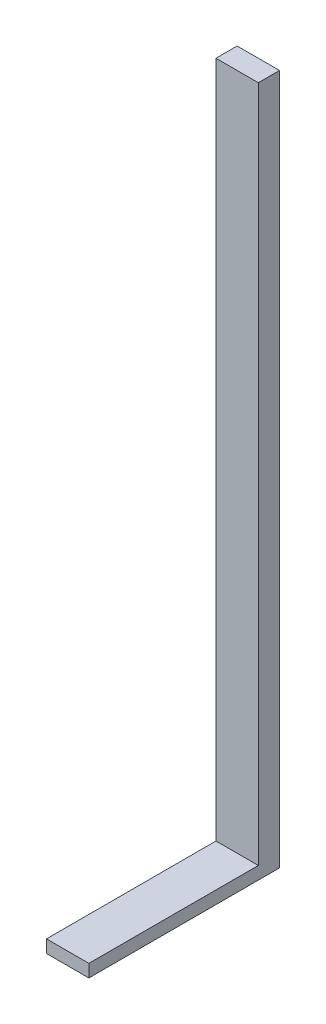
ISO-10303-21;
HEADER;
FILE_DESCRIPTION(('STEP AP214'),'2;1');
FILE_NAME('part.step','',(''),(''),'','','');
FILE_SCHEMA(('AUTOMOTIVE_DESIGN { 1 0 10303 214 1 1 1 1 }'));
ENDSEC;
DATA;
#1=APPLICATION_CONTEXT('core data for automotive mechanical design processes');
#2=APPLICATION_PROTOCOL_DEFINITION('international standard','automotive_design',2000,#1);
#3=PRODUCT_CONTEXT('',#1,'mechanical');
#4=PRODUCT('Part','Part','',(#3));
#5=PRODUCT_RELATED_PRODUCT_CATEGORY('part','',(#4));
#6=PRODUCT_DEFINITION_FORMATION('','',#4);
#7=PRODUCT_DEFINITION_CONTEXT('part definition',#1,'design');
#8=PRODUCT_DEFINITION('design','',#6,#7);
#9=PRODUCT_DEFINITION_SHAPE('','',#8);
#10=(LENGTH_UNIT() NAMED_UNIT(*) SI_UNIT(.MILLI.,.METRE.));
#11=(NAMED_UNIT(*) PLANE_ANGLE_UNIT() SI_UNIT($,.RADIAN.));
#12=(NAMED_UNIT(*) SI_UNIT($,.STERADIAN.) SOLID_ANGLE_UNIT());
#13=UNCERTAINTY_MEASURE_WITH_UNIT(LENGTH_MEASURE(1.E-05),#10,'distance_accuracy_value','');
#14=(GEOMETRIC_REPRESENTATION_CONTEXT(3) GLOBAL_UNCERTAINTY_ASSIGNED_CONTEXT((#13)) GLOBAL_UNIT_ASSIGNED_CONTEXT((#10,
#11,#12)) REPRESENTATION_CONTEXT('',''));
#15=CARTESIAN_POINT('',(0.,0.,0.));
#16=DIRECTION('',(0.,0.,1.));
#17=DIRECTION('',(1.,0.,0.));
#18=AXIS2_PLACEMENT_3D('',#15,#16,#17);
#19=CARTESIAN_POINT('',(10.,163.,0.));
#20=DIRECTION('',(0.,0.,1.));
#21=DIRECTION('',(0.,-1.,0.));
#22=AXIS2_PLACEMENT_3D('',#19,#20,#21);
#23=PLANE('',#22);
#24=DIRECTION('',(0.,1.,0.));
#25=VECTOR('',#24,1.);
#26=CARTESIAN_POINT('',(0.,163.,0.));
#27=LINE('',#26,#25);
#28=CARTESIAN_POINT('',(0.,0.,0.));
#29=VERTEX_POINT('',#28);
#30=CARTESIAN_POINT('',(0.,163.,0.));
#31=VERTEX_POINT('',#30);
#32=EDGE_CURVE('E117',#29,#31,#27,.T.);
#33=ORIENTED_EDGE('',*,*,#32,.T.);
#34=DIRECTION('',(-1.,0.,0.));
#35=VECTOR('',#34,1.);
#36=CARTESIAN_POINT('',(10.,163.,0.));
#37=LINE('',#36,#35);
#38=CARTESIAN_POINT('',(10.,163.,0.));
#39=VERTEX_POINT('',#38);
#40=EDGE_CURVE('E11',#39,#31,#37,.T.);
#41=ORIENTED_EDGE('',*,*,#40,.F.);
#42=DIRECTION('',(0.,1.,0.));
#43=VECTOR('',#42,1.);
#44=CARTESIAN_POINT('',(10.,163.,0.));
#45=LINE('',#44,#43);
#46=CARTESIAN_POINT('',(10.,0.,0.));
#47=VERTEX_POINT('',#46);
#48=EDGE_CURVE('E127',#47,#39,#45,.T.);
#49=ORIENTED_EDGE('',*,*,#48,.F.);
#50=DIRECTION('',(-1.,0.,0.));
#51=VECTOR('',#50,1.);
#52=CARTESIAN_POINT('',(10.,0.,0.));
#53=LINE('',#52,#51);
#54=EDGE_CURVE('E113',#47,#29,#53,.T.);
#55=ORIENTED_EDGE('',*,*,#54,.T.);
#56=EDGE_LOOP('',(#33,#41,#49,#55));
#57=FACE_BOUND('',#56,.T.);
#58=ADVANCED_FACE('F33',(#57),#23,.F.);
#59=CARTESIAN_POINT('',(10.,163.,5.));
#60=DIRECTION('',(0.,-1.,0.));
#61=DIRECTION('',(0.,0.,-1.));
#62=AXIS2_PLACEMENT_3D('',#59,#60,#61);
#63=PLANE('',#62);
#64=DIRECTION('',(0.,0.,1.));
#65=VECTOR('',#64,1.);
#66=CARTESIAN_POINT('',(0.,163.,5.));
#67=LINE('',#66,#65);
#68=CARTESIAN_POINT('',(0.,163.,5.));
#69=VERTEX_POINT('',#68);
#70=EDGE_CURVE('E120',#31,#69,#67,.T.);
#71=ORIENTED_EDGE('',*,*,#70,.T.);
#72=DIRECTION('',(-1.,0.,0.));
#73=VECTOR('',#72,1.);
#74=CARTESIAN_POINT('',(10.,163.,5.));
#75=LINE('',#74,#73);
#76=CARTESIAN_POINT('',(10.,163.,5.));
#77=VERTEX_POINT('',#76);
#78=EDGE_CURVE('E41',#77,#69,#75,.T.);
#79=ORIENTED_EDGE('',*,*,#78,.F.);
#80=DIRECTION('',(0.,0.,1.));
#81=VECTOR('',#80,1.);
#82=CARTESIAN_POINT('',(10.,163.,5.));
#83=LINE('',#82,#81);
#84=EDGE_CURVE('E86',#39,#77,#83,.T.);
#85=ORIENTED_EDGE('',*,*,#84,.F.);
#86=ORIENTED_EDGE('',*,*,#40,.T.);
#87=EDGE_LOOP('',(#71,#79,#85,#86));
#88=FACE_BOUND('',#87,.T.);
#89=ADVANCED_FACE('F151',(#88),#63,.F.);
#90=CARTESIAN_POINT('',(10.,2.99999999999999,5.));
#91=DIRECTION('',(0.,0.,-1.));
#92=DIRECTION('',(0.,1.,0.));
#93=AXIS2_PLACEMENT_3D('',#90,#91,#92);
#94=PLANE('',#93);
#95=DIRECTION('',(0.,-1.,0.));
#96=VECTOR('',#95,1.);
#97=CARTESIAN_POINT('',(0.,2.99999999999999,5.));
#98=LINE('',#97,#96);
#99=CARTESIAN_POINT('',(0.,2.99999999999999,5.));
#100=VERTEX_POINT('',#99);
#101=EDGE_CURVE('E122',#69,#100,#98,.T.);
#102=ORIENTED_EDGE('',*,*,#101,.T.);
#103=DIRECTION('',(-1.,0.,0.));
#104=VECTOR('',#103,1.);
#105=CARTESIAN_POINT('',(10.,2.99999999999999,5.));
#106=LINE('',#105,#104);
#107=CARTESIAN_POINT('',(10.,2.99999999999999,5.));
#108=VERTEX_POINT('',#107);
#109=EDGE_CURVE('E108',#108,#100,#106,.T.);
#110=ORIENTED_EDGE('',*,*,#109,.F.);
#111=DIRECTION('',(0.,-1.,0.));
#112=VECTOR('',#111,1.);
#113=CARTESIAN_POINT('',(10.,2.99999999999999,5.));
#114=LINE('',#113,#112);
#115=EDGE_CURVE('E99',#77,#108,#114,.T.);
#116=ORIENTED_EDGE('',*,*,#115,.F.);
#117=ORIENTED_EDGE('',*,*,#78,.T.);
#118=EDGE_LOOP('',(#102,#110,#116,#117));
#119=FACE_BOUND('',#118,.T.);
#120=ADVANCED_FACE('F133',(#119),#94,.F.);
#121=CARTESIAN_POINT('',(10.,2.99999999999999,45.));
#122=DIRECTION('',(0.,-1.,0.));
#123=DIRECTION('',(0.,0.,-1.));
#124=AXIS2_PLACEMENT_3D('',#121,#122,#123);
#125=PLANE('',#124);
#126=DIRECTION('',(0.,0.,1.));
#127=VECTOR('',#126,1.);
#128=CARTESIAN_POINT('',(0.,2.99999999999999,45.));
#129=LINE('',#128,#127);
#130=CARTESIAN_POINT('',(0.,2.99999999999999,45.));
#131=VERTEX_POINT('',#130);
#132=EDGE_CURVE('E107',#100,#131,#129,.T.);
#133=ORIENTED_EDGE('',*,*,#132,.T.);
#134=DIRECTION('',(-1.,0.,0.));
#135=VECTOR('',#134,1.);
#136=CARTESIAN_POINT('',(10.,2.99999999999999,45.));
#137=LINE('',#136,#135);
#138=CARTESIAN_POINT('',(10.,2.99999999999999,45.));
#139=VERTEX_POINT('',#138);
#140=EDGE_CURVE('E104',#139,#131,#137,.T.);
#141=ORIENTED_EDGE('',*,*,#140,.F.);
#142=DIRECTION('',(0.,0.,1.));
#143=VECTOR('',#142,1.);
#144=CARTESIAN_POINT('',(10.,2.99999999999999,45.));
#145=LINE('',#144,#143);
#146=EDGE_CURVE('E93',#108,#139,#145,.T.);
#147=ORIENTED_EDGE('',*,*,#146,.F.);
#148=ORIENTED_EDGE('',*,*,#109,.T.);
#149=EDGE_LOOP('',(#133,#141,#147,#148));
#150=FACE_BOUND('',#149,.T.);
#151=ADVANCED_FACE('F105',(#150),#125,.F.);
#152=CARTESIAN_POINT('',(10.,0.,45.));
#153=DIRECTION('',(0.,0.,-1.));
#154=DIRECTION('',(-1.,0.,0.));
#155=AXIS2_PLACEMENT_3D('',#152,#153,#154);
#156=PLANE('',#155);
#157=DIRECTION('',(0.,-1.,0.));
#158=VECTOR('',#157,1.);
#159=CARTESIAN_POINT('',(0.,0.,45.));
#160=LINE('',#159,#158);
#161=CARTESIAN_POINT('',(0.,0.,45.));
#162=VERTEX_POINT('',#161);
#163=EDGE_CURVE('E72',#131,#162,#160,.T.);
#164=ORIENTED_EDGE('',*,*,#163,.T.);
#165=DIRECTION('',(-1.,0.,0.));
#166=VECTOR('',#165,1.);
#167=CARTESIAN_POINT('',(10.,0.,45.));
#168=LINE('',#167,#166);
#169=CARTESIAN_POINT('',(10.,0.,45.));
#170=VERTEX_POINT('',#169);
#171=EDGE_CURVE('E109',#170,#162,#168,.T.);
#172=ORIENTED_EDGE('',*,*,#171,.F.);
#173=DIRECTION('',(0.,-1.,0.));
#174=VECTOR('',#173,1.);
#175=CARTESIAN_POINT('',(10.,0.,45.));
#176=LINE('',#175,#174);
#177=EDGE_CURVE('E97',#139,#170,#176,.T.);
#178=ORIENTED_EDGE('',*,*,#177,.F.);
#179=ORIENTED_EDGE('',*,*,#140,.T.);
#180=EDGE_LOOP('',(#164,#172,#178,#179));
#181=FACE_BOUND('',#180,.T.);
#182=ADVANCED_FACE('F111',(#181),#156,.F.);
#183=CARTESIAN_POINT('',(10.,0.,0.));
#184=DIRECTION('',(0.,1.,0.));
#185=DIRECTION('',(0.,0.,1.));
#186=AXIS2_PLACEMENT_3D('',#183,#184,#185);
#187=PLANE('',#186);
#188=DIRECTION('',(0.,0.,-1.));
#189=VECTOR('',#188,1.);
#190=CARTESIAN_POINT('',(0.,0.,0.));
#191=LINE('',#190,#189);
#192=EDGE_CURVE('E78',#162,#29,#191,.T.);
#193=ORIENTED_EDGE('',*,*,#192,.T.);
#194=ORIENTED_EDGE('',*,*,#54,.F.);
#195=DIRECTION('',(0.,0.,-1.));
#196=VECTOR('',#195,1.);
#197=CARTESIAN_POINT('',(10.,0.,0.));
#198=LINE('',#197,#196);
#199=EDGE_CURVE('E49',#170,#47,#198,.T.);
#200=ORIENTED_EDGE('',*,*,#199,.F.);
#201=ORIENTED_EDGE('',*,*,#171,.T.);
#202=EDGE_LOOP('',(#193,#194,#200,#201));
#203=FACE_BOUND('',#202,.T.);
#204=ADVANCED_FACE('F140',(#203),#187,.F.);
#205=CARTESIAN_POINT('',(10.,0.,0.));
#206=DIRECTION('',(-1.,0.,0.));
#207=DIRECTION('',(0.,0.,1.));
#208=AXIS2_PLACEMENT_3D('',#205,#206,#207);
#209=PLANE('',#208);
#210=ORIENTED_EDGE('',*,*,#48,.T.);
#211=ORIENTED_EDGE('',*,*,#84,.T.);
#212=ORIENTED_EDGE('',*,*,#115,.T.);
#213=ORIENTED_EDGE('',*,*,#146,.T.);
#214=ORIENTED_EDGE('',*,*,#177,.T.);
#215=ORIENTED_EDGE('',*,*,#199,.T.);
#216=EDGE_LOOP('',(#210,#211,#212,#213,#214,#215));
#217=FACE_BOUND('',#216,.T.);
#218=ADVANCED_FACE('F95',(#217),#209,.F.);
#219=CARTESIAN_POINT('',(0.,0.,0.));
#220=DIRECTION('',(-1.,0.,0.));
#221=DIRECTION('',(0.,0.,1.));
#222=AXIS2_PLACEMENT_3D('',#219,#220,#221);
#223=PLANE('',#222);
#224=ORIENTED_EDGE('',*,*,#32,.F.);
#225=ORIENTED_EDGE('',*,*,#192,.F.);
#226=ORIENTED_EDGE('',*,*,#163,.F.);
#227=ORIENTED_EDGE('',*,*,#132,.F.);
#228=ORIENTED_EDGE('',*,*,#101,.F.);
#229=ORIENTED_EDGE('',*,*,#70,.F.);
#230=EDGE_LOOP('',(#224,#225,#226,#227,#228,#229));
#231=FACE_BOUND('',#230,.T.);
#232=ADVANCED_FACE('F136',(#231),#223,.T.);
#233=CLOSED_SHELL('',(#58,#89,#120,#151,#182,#204,#218,#232));
#234=MANIFOLD_SOLID_BREP('B2',#233);
#235=ADVANCED_BREP_SHAPE_REPRESENTATION('',(#18,#234),#14);
#236=SHAPE_DEFINITION_REPRESENTATION(#9,#235);
ENDSEC;
END-ISO-10303-21;
